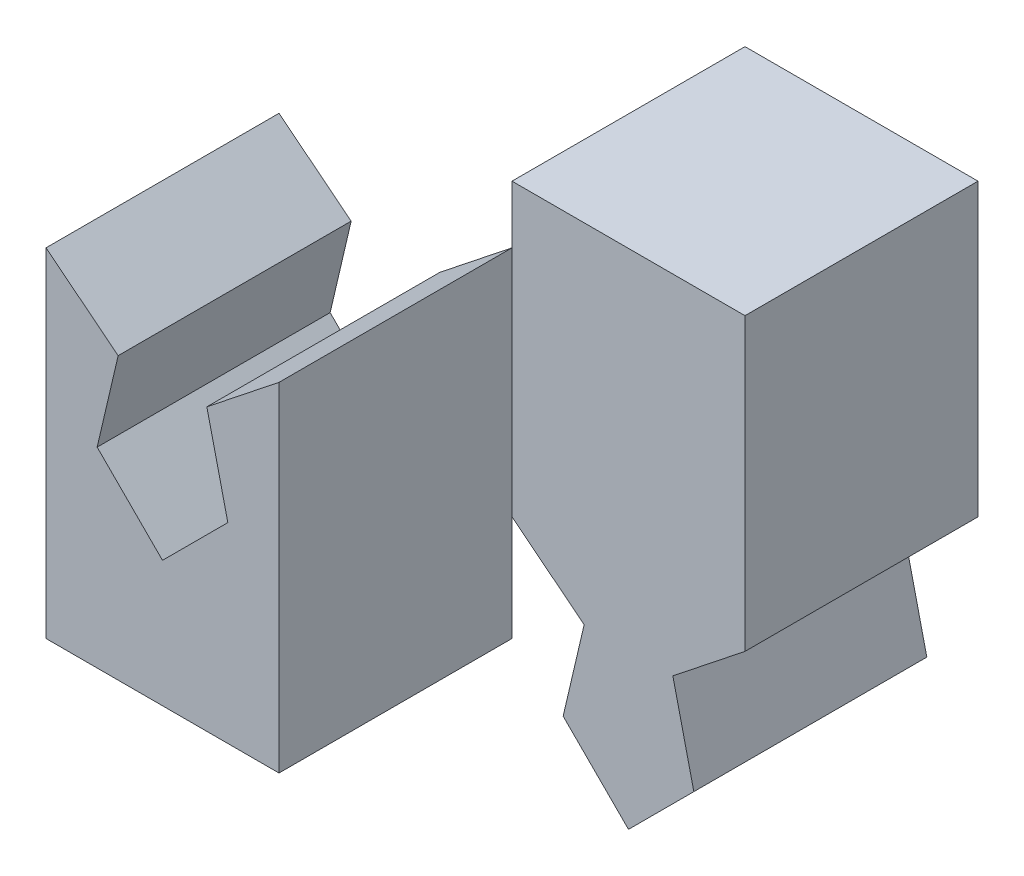
ISO-10303-21;
HEADER;
FILE_DESCRIPTION(('STEP AP214'),'2;1');
FILE_NAME('part.step','',(''),(''),'','','');
FILE_SCHEMA(('AUTOMOTIVE_DESIGN { 1 0 10303 214 1 1 1 1 }'));
ENDSEC;
DATA;
#1=APPLICATION_CONTEXT('core data for automotive mechanical design processes');
#2=APPLICATION_PROTOCOL_DEFINITION('international standard','automotive_design',2000,#1);
#3=PRODUCT_CONTEXT('',#1,'mechanical');
#4=PRODUCT('Part','Part','',(#3));
#5=PRODUCT_RELATED_PRODUCT_CATEGORY('part','',(#4));
#6=PRODUCT_DEFINITION_FORMATION('','',#4);
#7=PRODUCT_DEFINITION_CONTEXT('part definition',#1,'design');
#8=PRODUCT_DEFINITION('design','',#6,#7);
#9=PRODUCT_DEFINITION_SHAPE('','',#8);
#10=(LENGTH_UNIT() NAMED_UNIT(*) SI_UNIT(.MILLI.,.METRE.));
#11=(NAMED_UNIT(*) PLANE_ANGLE_UNIT() SI_UNIT($,.RADIAN.));
#12=(NAMED_UNIT(*) SI_UNIT($,.STERADIAN.) SOLID_ANGLE_UNIT());
#13=UNCERTAINTY_MEASURE_WITH_UNIT(LENGTH_MEASURE(1.E-05),#10,'distance_accuracy_value','');
#14=(GEOMETRIC_REPRESENTATION_CONTEXT(3) GLOBAL_UNCERTAINTY_ASSIGNED_CONTEXT((#13)) GLOBAL_UNIT_ASSIGNED_CONTEXT((#10,
#11,#12)) REPRESENTATION_CONTEXT('',''));
#15=CARTESIAN_POINT('',(0.,0.,0.));
#16=DIRECTION('',(0.,0.,1.));
#17=DIRECTION('',(1.,0.,0.));
#18=AXIS2_PLACEMENT_3D('',#15,#16,#17);
#19=CARTESIAN_POINT('',(12.5,13.5,-2.5));
#20=DIRECTION('',(-1.,0.,0.));
#21=DIRECTION('',(0.,0.,1.));
#22=AXIS2_PLACEMENT_3D('',#19,#20,#21);
#23=PLANE('',#22);
#24=DIRECTION('',(0.,-1.,0.));
#25=VECTOR('',#24,1.);
#26=CARTESIAN_POINT('',(12.5,13.5,2.5));
#27=LINE('',#26,#25);
#28=CARTESIAN_POINT('',(12.5,13.5,2.5));
#29=VERTEX_POINT('',#28);
#30=CARTESIAN_POINT('',(12.5,7.2608694026126,2.5));
#31=VERTEX_POINT('',#30);
#32=EDGE_CURVE('E182',#29,#31,#27,.T.);
#33=ORIENTED_EDGE('',*,*,#32,.T.);
#34=DIRECTION('',(0.,0.,1.));
#35=VECTOR('',#34,1.);
#36=CARTESIAN_POINT('',(12.5,7.2608694026126,-11.));
#37=LINE('',#36,#35);
#38=CARTESIAN_POINT('',(12.5,7.2608694026126,-2.5));
#39=VERTEX_POINT('',#38);
#40=EDGE_CURVE('E59',#39,#31,#37,.T.);
#41=ORIENTED_EDGE('',*,*,#40,.F.);
#42=DIRECTION('',(0.,-1.,0.));
#43=VECTOR('',#42,1.);
#44=CARTESIAN_POINT('',(12.5,13.5,-2.5));
#45=LINE('',#44,#43);
#46=CARTESIAN_POINT('',(12.5,13.5,-2.5));
#47=VERTEX_POINT('',#46);
#48=EDGE_CURVE('E12',#47,#39,#45,.T.);
#49=ORIENTED_EDGE('',*,*,#48,.F.);
#50=DIRECTION('',(0.,0.,-1.));
#51=VECTOR('',#50,1.);
#52=CARTESIAN_POINT('',(12.5,13.5,-2.5));
#53=LINE('',#52,#51);
#54=EDGE_CURVE('E175',#29,#47,#53,.T.);
#55=ORIENTED_EDGE('',*,*,#54,.F.);
#56=EDGE_LOOP('',(#33,#41,#49,#55));
#57=FACE_BOUND('',#56,.T.);
#58=ADVANCED_FACE('F45',(#57),#23,.F.);
#59=CARTESIAN_POINT('',(7.5,13.5,-2.5));
#60=DIRECTION('',(0.,0.,1.));
#61=DIRECTION('',(1.,0.,0.));
#62=AXIS2_PLACEMENT_3D('',#59,#60,#61);
#63=PLANE('',#62);
#64=DIRECTION('',(0.227884467377887,0.973688178796424,0.));
#65=VECTOR('',#64,1.);
#66=CARTESIAN_POINT('',(10.6252477350819,12.7685590407255,-2.5));
#67=LINE('',#66,#65);
#68=CARTESIAN_POINT('',(8.59767658269611,4.10530048053174,-2.5));
#69=VERTEX_POINT('',#68);
#70=CARTESIAN_POINT('',(9.04847214299338,6.03142696543824,-2.5));
#71=VERTEX_POINT('',#70);
#72=EDGE_CURVE('E169',#69,#71,#67,.T.);
#73=ORIENTED_EDGE('',*,*,#72,.T.);
#74=DIRECTION('',(-0.783166662523969,0.621811851536353,0.));
#75=VECTOR('',#74,1.);
#76=CARTESIAN_POINT('',(4.46165375378477,9.67322911526801,-2.5));
#77=LINE('',#76,#75);
#78=CARTESIAN_POINT('',(7.5,7.2608694026126,-2.5));
#79=VERTEX_POINT('',#78);
#80=EDGE_CURVE('E172',#71,#79,#77,.T.);
#81=ORIENTED_EDGE('',*,*,#80,.T.);
#82=DIRECTION('',(0.,-1.,0.));
#83=VECTOR('',#82,1.);
#84=CARTESIAN_POINT('',(7.5,13.5,-2.5));
#85=LINE('',#84,#83);
#86=CARTESIAN_POINT('',(7.5,13.5,-2.5));
#87=VERTEX_POINT('',#86);
#88=EDGE_CURVE('E52',#87,#79,#85,.T.);
#89=ORIENTED_EDGE('',*,*,#88,.F.);
#90=DIRECTION('',(-1.,0.,0.));
#91=VECTOR('',#90,1.);
#92=CARTESIAN_POINT('',(7.5,13.5,-2.5));
#93=LINE('',#92,#91);
#94=EDGE_CURVE('E177',#47,#87,#93,.T.);
#95=ORIENTED_EDGE('',*,*,#94,.F.);
#96=ORIENTED_EDGE('',*,*,#48,.T.);
#97=DIRECTION('',(-0.783166662523969,-0.621811851536354,0.));
#98=VECTOR('',#97,1.);
#99=CARTESIAN_POINT('',(12.4715961397706,7.23831755284014,-2.5));
#100=LINE('',#99,#98);
#101=CARTESIAN_POINT('',(10.9515278570066,6.03142696543824,-2.5));
#102=VERTEX_POINT('',#101);
#103=EDGE_CURVE('E152',#39,#102,#100,.T.);
#104=ORIENTED_EDGE('',*,*,#103,.T.);
#105=DIRECTION('',(0.227884467377887,-0.973688178796424,0.));
#106=VECTOR('',#105,1.);
#107=CARTESIAN_POINT('',(9.11509561255759,13.8780011008114,-2.5));
#108=LINE('',#107,#106);
#109=CARTESIAN_POINT('',(11.4023234173039,4.10530048053174,-2.5));
#110=VERTEX_POINT('',#109);
#111=EDGE_CURVE('E124',#102,#110,#108,.T.);
#112=ORIENTED_EDGE('',*,*,#111,.T.);
#113=DIRECTION('',(-0.707106781186548,-0.707106781186548,0.));
#114=VECTOR('',#113,1.);
#115=CARTESIAN_POINT('',(14.1485114683861,6.85148853161393,-2.5));
#116=LINE('',#115,#114);
#117=CARTESIAN_POINT('',(10.,2.70297706322785,-2.5));
#118=VERTEX_POINT('',#117);
#119=EDGE_CURVE('E163',#110,#118,#116,.T.);
#120=ORIENTED_EDGE('',*,*,#119,.T.);
#121=DIRECTION('',(-0.707106781186548,0.707106781186548,0.));
#122=VECTOR('',#121,1.);
#123=CARTESIAN_POINT('',(3.35148853161393,9.35148853161392,-2.5));
#124=LINE('',#123,#122);
#125=EDGE_CURVE('E166',#118,#69,#124,.T.);
#126=ORIENTED_EDGE('',*,*,#125,.T.);
#127=EDGE_LOOP('',(#73,#81,#89,#95,#96,#104,#112,#120,#126));
#128=FACE_BOUND('',#127,.T.);
#129=ADVANCED_FACE('F192',(#128),#63,.F.);
#130=CARTESIAN_POINT('',(7.5,13.5,-2.5));
#131=DIRECTION('',(1.,0.,0.));
#132=DIRECTION('',(0.,0.,-1.));
#133=AXIS2_PLACEMENT_3D('',#130,#131,#132);
#134=PLANE('',#133);
#135=ORIENTED_EDGE('',*,*,#88,.T.);
#136=DIRECTION('',(0.,0.,1.));
#137=VECTOR('',#136,1.);
#138=CARTESIAN_POINT('',(7.5,7.2608694026126,-11.));
#139=LINE('',#138,#137);
#140=CARTESIAN_POINT('',(7.5,7.2608694026126,2.5));
#141=VERTEX_POINT('',#140);
#142=EDGE_CURVE('E149',#79,#141,#139,.T.);
#143=ORIENTED_EDGE('',*,*,#142,.T.);
#144=DIRECTION('',(0.,-1.,0.));
#145=VECTOR('',#144,1.);
#146=CARTESIAN_POINT('',(7.5,13.5,2.5));
#147=LINE('',#146,#145);
#148=CARTESIAN_POINT('',(7.5,13.5,2.5));
#149=VERTEX_POINT('',#148);
#150=EDGE_CURVE('E184',#149,#141,#147,.T.);
#151=ORIENTED_EDGE('',*,*,#150,.F.);
#152=DIRECTION('',(0.,0.,1.));
#153=VECTOR('',#152,1.);
#154=CARTESIAN_POINT('',(7.5,13.5,-2.5));
#155=LINE('',#154,#153);
#156=EDGE_CURVE('E179',#87,#149,#155,.T.);
#157=ORIENTED_EDGE('',*,*,#156,.F.);
#158=EDGE_LOOP('',(#135,#143,#151,#157));
#159=FACE_BOUND('',#158,.T.);
#160=ADVANCED_FACE('F189',(#159),#134,.F.);
#161=CARTESIAN_POINT('',(7.5,13.5,2.5));
#162=DIRECTION('',(0.,0.,-1.));
#163=DIRECTION('',(-1.,0.,0.));
#164=AXIS2_PLACEMENT_3D('',#161,#162,#163);
#165=PLANE('',#164);
#166=ORIENTED_EDGE('',*,*,#150,.T.);
#167=DIRECTION('',(-0.783166662523969,0.621811851536353,0.));
#168=VECTOR('',#167,1.);
#169=CARTESIAN_POINT('',(7.5,7.2608694026126,2.5));
#170=LINE('',#169,#168);
#171=CARTESIAN_POINT('',(9.04847214299338,6.03142696543824,2.5));
#172=VERTEX_POINT('',#171);
#173=EDGE_CURVE('E147',#172,#141,#170,.T.);
#174=ORIENTED_EDGE('',*,*,#173,.F.);
#175=DIRECTION('',(0.227884467377887,0.973688178796424,0.));
#176=VECTOR('',#175,1.);
#177=CARTESIAN_POINT('',(9.04847214299338,6.03142696543824,2.5));
#178=LINE('',#177,#176);
#179=CARTESIAN_POINT('',(8.59767658269611,4.10530048053174,2.5));
#180=VERTEX_POINT('',#179);
#181=EDGE_CURVE('E144',#180,#172,#178,.T.);
#182=ORIENTED_EDGE('',*,*,#181,.F.);
#183=DIRECTION('',(-0.707106781186548,0.707106781186548,0.));
#184=VECTOR('',#183,1.);
#185=CARTESIAN_POINT('',(8.59767658269611,4.10530048053174,2.5));
#186=LINE('',#185,#184);
#187=CARTESIAN_POINT('',(10.,2.70297706322785,2.5));
#188=VERTEX_POINT('',#187);
#189=EDGE_CURVE('E139',#188,#180,#186,.T.);
#190=ORIENTED_EDGE('',*,*,#189,.F.);
#191=DIRECTION('',(-0.707106781186548,-0.707106781186548,0.));
#192=VECTOR('',#191,1.);
#193=CARTESIAN_POINT('',(11.4023234173039,4.10530048053174,2.5));
#194=LINE('',#193,#192);
#195=CARTESIAN_POINT('',(11.4023234173039,4.10530048053174,2.5));
#196=VERTEX_POINT('',#195);
#197=EDGE_CURVE('E137',#196,#188,#194,.T.);
#198=ORIENTED_EDGE('',*,*,#197,.F.);
#199=DIRECTION('',(0.227884467377887,-0.973688178796424,0.));
#200=VECTOR('',#199,1.);
#201=CARTESIAN_POINT('',(10.9515278570066,6.03142696543824,2.5));
#202=LINE('',#201,#200);
#203=CARTESIAN_POINT('',(10.9515278570066,6.03142696543824,2.5));
#204=VERTEX_POINT('',#203);
#205=EDGE_CURVE('E121',#204,#196,#202,.T.);
#206=ORIENTED_EDGE('',*,*,#205,.F.);
#207=DIRECTION('',(-0.783166662523969,-0.621811851536354,0.));
#208=VECTOR('',#207,1.);
#209=CARTESIAN_POINT('',(12.5,7.2608694026126,2.5));
#210=LINE('',#209,#208);
#211=EDGE_CURVE('E128',#31,#204,#210,.T.);
#212=ORIENTED_EDGE('',*,*,#211,.F.);
#213=ORIENTED_EDGE('',*,*,#32,.F.);
#214=DIRECTION('',(1.,0.,0.));
#215=VECTOR('',#214,1.);
#216=CARTESIAN_POINT('',(7.5,13.5,2.5));
#217=LINE('',#216,#215);
#218=EDGE_CURVE('E67',#149,#29,#217,.T.);
#219=ORIENTED_EDGE('',*,*,#218,.F.);
#220=EDGE_LOOP('',(#166,#174,#182,#190,#198,#206,#212,#213,#219));
#221=FACE_BOUND('',#220,.T.);
#222=ADVANCED_FACE('F134',(#221),#165,.F.);
#223=CARTESIAN_POINT('',(0.,13.5,0.));
#224=DIRECTION('',(0.,1.,0.));
#225=DIRECTION('',(0.,0.,1.));
#226=AXIS2_PLACEMENT_3D('',#223,#224,#225);
#227=PLANE('',#226);
#228=ORIENTED_EDGE('',*,*,#54,.T.);
#229=ORIENTED_EDGE('',*,*,#94,.T.);
#230=ORIENTED_EDGE('',*,*,#156,.T.);
#231=ORIENTED_EDGE('',*,*,#218,.T.);
#232=EDGE_LOOP('',(#228,#229,#230,#231));
#233=FACE_BOUND('',#232,.T.);
#234=ADVANCED_FACE('F204',(#233),#227,.T.);
#235=CARTESIAN_POINT('',(7.5,7.2608694026126,-11.));
#236=DIRECTION('',(0.621811851536353,0.783166662523969,0.));
#237=DIRECTION('',(-0.783166662523969,0.621811851536353,0.));
#238=AXIS2_PLACEMENT_3D('',#235,#236,#237);
#239=PLANE('',#238);
#240=DIRECTION('',(0.,0.,1.));
#241=VECTOR('',#240,1.);
#242=CARTESIAN_POINT('',(9.04847214299338,6.03142696543824,-11.));
#243=LINE('',#242,#241);
#244=EDGE_CURVE('E153',#71,#172,#243,.T.);
#245=ORIENTED_EDGE('',*,*,#244,.T.);
#246=ORIENTED_EDGE('',*,*,#173,.T.);
#247=ORIENTED_EDGE('',*,*,#142,.F.);
#248=ORIENTED_EDGE('',*,*,#80,.F.);
#249=EDGE_LOOP('',(#245,#246,#247,#248));
#250=FACE_BOUND('',#249,.T.);
#251=ADVANCED_FACE('F195',(#250),#239,.F.);
#252=CARTESIAN_POINT('',(9.04847214299338,6.03142696543824,-11.));
#253=DIRECTION('',(0.973688178796424,-0.227884467377887,0.));
#254=DIRECTION('',(0.227884467377887,0.973688178796424,0.));
#255=AXIS2_PLACEMENT_3D('',#252,#253,#254);
#256=PLANE('',#255);
#257=DIRECTION('',(0.,0.,1.));
#258=VECTOR('',#257,1.);
#259=CARTESIAN_POINT('',(8.59767658269611,4.10530048053174,-11.));
#260=LINE('',#259,#258);
#261=EDGE_CURVE('E155',#69,#180,#260,.T.);
#262=ORIENTED_EDGE('',*,*,#261,.T.);
#263=ORIENTED_EDGE('',*,*,#181,.T.);
#264=ORIENTED_EDGE('',*,*,#244,.F.);
#265=ORIENTED_EDGE('',*,*,#72,.F.);
#266=EDGE_LOOP('',(#262,#263,#264,#265));
#267=FACE_BOUND('',#266,.T.);
#268=ADVANCED_FACE('F197',(#267),#256,.F.);
#269=CARTESIAN_POINT('',(8.59767658269611,4.10530048053174,-11.));
#270=DIRECTION('',(0.707106781186547,0.707106781186547,0.));
#271=DIRECTION('',(-0.707106781186548,0.707106781186548,0.));
#272=AXIS2_PLACEMENT_3D('',#269,#270,#271);
#273=PLANE('',#272);
#274=DIRECTION('',(0.,0.,1.));
#275=VECTOR('',#274,1.);
#276=CARTESIAN_POINT('',(10.,2.70297706322785,-11.));
#277=LINE('',#276,#275);
#278=EDGE_CURVE('E157',#118,#188,#277,.T.);
#279=ORIENTED_EDGE('',*,*,#278,.T.);
#280=ORIENTED_EDGE('',*,*,#189,.T.);
#281=ORIENTED_EDGE('',*,*,#261,.F.);
#282=ORIENTED_EDGE('',*,*,#125,.F.);
#283=EDGE_LOOP('',(#279,#280,#281,#282));
#284=FACE_BOUND('',#283,.T.);
#285=ADVANCED_FACE('F244',(#284),#273,.F.);
#286=CARTESIAN_POINT('',(11.4023234173039,4.10530048053174,-11.));
#287=DIRECTION('',(-0.707106781186547,0.707106781186547,0.));
#288=DIRECTION('',(-0.707106781186548,-0.707106781186548,0.));
#289=AXIS2_PLACEMENT_3D('',#286,#287,#288);
#290=PLANE('',#289);
#291=DIRECTION('',(0.,0.,1.));
#292=VECTOR('',#291,1.);
#293=CARTESIAN_POINT('',(11.4023234173039,4.10530048053174,-11.));
#294=LINE('',#293,#292);
#295=EDGE_CURVE('E126',#110,#196,#294,.T.);
#296=ORIENTED_EDGE('',*,*,#295,.T.);
#297=ORIENTED_EDGE('',*,*,#197,.T.);
#298=ORIENTED_EDGE('',*,*,#278,.F.);
#299=ORIENTED_EDGE('',*,*,#119,.F.);
#300=EDGE_LOOP('',(#296,#297,#298,#299));
#301=FACE_BOUND('',#300,.T.);
#302=ADVANCED_FACE('F253',(#301),#290,.F.);
#303=CARTESIAN_POINT('',(10.9515278570066,6.03142696543824,-11.));
#304=DIRECTION('',(-0.973688178796424,-0.227884467377887,0.));
#305=DIRECTION('',(0.227884467377887,-0.973688178796424,0.));
#306=AXIS2_PLACEMENT_3D('',#303,#304,#305);
#307=PLANE('',#306);
#308=DIRECTION('',(0.,0.,1.));
#309=VECTOR('',#308,1.);
#310=CARTESIAN_POINT('',(10.9515278570066,6.03142696543824,-11.));
#311=LINE('',#310,#309);
#312=EDGE_CURVE('E117',#102,#204,#311,.T.);
#313=ORIENTED_EDGE('',*,*,#312,.T.);
#314=ORIENTED_EDGE('',*,*,#205,.T.);
#315=ORIENTED_EDGE('',*,*,#295,.F.);
#316=ORIENTED_EDGE('',*,*,#111,.F.);
#317=EDGE_LOOP('',(#313,#314,#315,#316));
#318=FACE_BOUND('',#317,.T.);
#319=ADVANCED_FACE('F118',(#318),#307,.F.);
#320=CARTESIAN_POINT('',(12.5,7.2608694026126,-11.));
#321=DIRECTION('',(-0.621811851536354,0.783166662523969,0.));
#322=DIRECTION('',(-0.783166662523969,-0.621811851536354,0.));
#323=AXIS2_PLACEMENT_3D('',#320,#321,#322);
#324=PLANE('',#323);
#325=ORIENTED_EDGE('',*,*,#40,.T.);
#326=ORIENTED_EDGE('',*,*,#211,.T.);
#327=ORIENTED_EDGE('',*,*,#312,.F.);
#328=ORIENTED_EDGE('',*,*,#103,.F.);
#329=EDGE_LOOP('',(#325,#326,#327,#328));
#330=FACE_BOUND('',#329,.T.);
#331=ADVANCED_FACE('F129',(#330),#324,.F.);
#332=CLOSED_SHELL('',(#58,#129,#160,#222,#234,#251,#268,#285,#302,#319,#331));
#333=MANIFOLD_SOLID_BREP('B2',#332);
#334=CARTESIAN_POINT('',(-2.5,13.5,2.5));
#335=DIRECTION('',(0.,0.,-1.));
#336=DIRECTION('',(-1.,0.,0.));
#337=AXIS2_PLACEMENT_3D('',#334,#335,#336);
#338=PLANE('',#337);
#339=DIRECTION('',(0.,-1.,0.));
#340=VECTOR('',#339,1.);
#341=CARTESIAN_POINT('',(2.5,13.5,2.5));
#342=LINE('',#341,#340);
#343=CARTESIAN_POINT('',(2.5,7.2608694026126,2.5));
#344=VERTEX_POINT('',#343);
#345=CARTESIAN_POINT('',(2.5,0.,2.5));
#346=VERTEX_POINT('',#345);
#347=EDGE_CURVE('E396',#344,#346,#342,.T.);
#348=ORIENTED_EDGE('',*,*,#347,.F.);
#349=DIRECTION('',(0.783166662523969,0.621811851536353,0.));
#350=VECTOR('',#349,1.);
#351=CARTESIAN_POINT('',(2.5,7.2608694026126,2.5));
#352=LINE('',#351,#350);
#353=CARTESIAN_POINT('',(0.951527857006619,6.03142696543824,2.5));
#354=VERTEX_POINT('',#353);
#355=EDGE_CURVE('E376',#354,#344,#352,.T.);
#356=ORIENTED_EDGE('',*,*,#355,.F.);
#357=DIRECTION('',(-0.227884467377887,0.973688178796424,0.));
#358=VECTOR('',#357,1.);
#359=CARTESIAN_POINT('',(0.951527857006619,6.03142696543824,2.5));
#360=LINE('',#359,#358);
#361=CARTESIAN_POINT('',(1.40232341730389,4.10530048053174,2.5));
#362=VERTEX_POINT('',#361);
#363=EDGE_CURVE('E453',#362,#354,#360,.T.);
#364=ORIENTED_EDGE('',*,*,#363,.F.);
#365=DIRECTION('',(0.707106781186548,0.707106781186548,0.));
#366=VECTOR('',#365,1.);
#367=CARTESIAN_POINT('',(1.40232341730389,4.10530048053174,2.5));
#368=LINE('',#367,#366);
#369=CARTESIAN_POINT('',(0.,2.70297706322785,2.5));
#370=VERTEX_POINT('',#369);
#371=EDGE_CURVE('E419',#370,#362,#368,.T.);
#372=ORIENTED_EDGE('',*,*,#371,.F.);
#373=DIRECTION('',(0.707106781186548,-0.707106781186548,0.));
#374=VECTOR('',#373,1.);
#375=CARTESIAN_POINT('',(-1.40232341730389,4.10530048053174,2.5));
#376=LINE('',#375,#374);
#377=CARTESIAN_POINT('',(-1.40232341730389,4.10530048053174,2.5));
#378=VERTEX_POINT('',#377);
#379=EDGE_CURVE('E548',#378,#370,#376,.T.);
#380=ORIENTED_EDGE('',*,*,#379,.F.);
#381=DIRECTION('',(-0.227884467377887,-0.973688178796424,0.));
#382=VECTOR('',#381,1.);
#383=CARTESIAN_POINT('',(-0.951527857006619,6.03142696543824,2.5));
#384=LINE('',#383,#382);
#385=CARTESIAN_POINT('',(-0.951527857006619,6.03142696543824,2.5));
#386=VERTEX_POINT('',#385);
#387=EDGE_CURVE('E381',#386,#378,#384,.T.);
#388=ORIENTED_EDGE('',*,*,#387,.F.);
#389=DIRECTION('',(0.783166662523969,-0.621811851536353,0.));
#390=VECTOR('',#389,1.);
#391=CARTESIAN_POINT('',(-2.5,7.2608694026126,2.5));
#392=LINE('',#391,#390);
#393=CARTESIAN_POINT('',(-2.5,7.2608694026126,2.5));
#394=VERTEX_POINT('',#393);
#395=EDGE_CURVE('E371',#394,#386,#392,.T.);
#396=ORIENTED_EDGE('',*,*,#395,.F.);
#397=DIRECTION('',(0.,-1.,0.));
#398=VECTOR('',#397,1.);
#399=CARTESIAN_POINT('',(-2.5,13.5,2.5));
#400=LINE('',#399,#398);
#401=CARTESIAN_POINT('',(-2.5,0.,2.5));
#402=VERTEX_POINT('',#401);
#403=EDGE_CURVE('E321',#394,#402,#400,.T.);
#404=ORIENTED_EDGE('',*,*,#403,.T.);
#405=DIRECTION('',(1.,0.,0.));
#406=VECTOR('',#405,1.);
#407=CARTESIAN_POINT('',(-2.5,0.,2.5));
#408=LINE('',#407,#406);
#409=EDGE_CURVE('E438',#402,#346,#408,.T.);
#410=ORIENTED_EDGE('',*,*,#409,.T.);
#411=EDGE_LOOP('',(#348,#356,#364,#372,#380,#388,#396,#404,#410));
#412=FACE_BOUND('',#411,.T.);
#413=ADVANCED_FACE('F299',(#412),#338,.F.);
#414=CARTESIAN_POINT('',(2.5,13.5,-2.5));
#415=DIRECTION('',(1.,0.,0.));
#416=DIRECTION('',(0.,0.,-1.));
#417=AXIS2_PLACEMENT_3D('',#414,#415,#416);
#418=PLANE('',#417);
#419=DIRECTION('',(0.,0.,1.));
#420=VECTOR('',#419,1.);
#421=CARTESIAN_POINT('',(2.5,7.2608694026126,-11.));
#422=LINE('',#421,#420);
#423=CARTESIAN_POINT('',(2.5,7.2608694026126,-2.5));
#424=VERTEX_POINT('',#423);
#425=EDGE_CURVE('E439',#424,#344,#422,.T.);
#426=ORIENTED_EDGE('',*,*,#425,.T.);
#427=ORIENTED_EDGE('',*,*,#347,.T.);
#428=DIRECTION('',(0.,0.,1.));
#429=VECTOR('',#428,1.);
#430=CARTESIAN_POINT('',(2.5,0.,-2.5));
#431=LINE('',#430,#429);
#432=CARTESIAN_POINT('',(2.5,0.,-2.5));
#433=VERTEX_POINT('',#432);
#434=EDGE_CURVE('E441',#433,#346,#431,.T.);
#435=ORIENTED_EDGE('',*,*,#434,.F.);
#436=DIRECTION('',(0.,-1.,0.));
#437=VECTOR('',#436,1.);
#438=CARTESIAN_POINT('',(2.5,13.5,-2.5));
#439=LINE('',#438,#437);
#440=EDGE_CURVE('E389',#424,#433,#439,.T.);
#441=ORIENTED_EDGE('',*,*,#440,.F.);
#442=EDGE_LOOP('',(#426,#427,#435,#441));
#443=FACE_BOUND('',#442,.T.);
#444=ADVANCED_FACE('F451',(#443),#418,.T.);
#445=CARTESIAN_POINT('',(-2.5,13.5,-2.5));
#446=DIRECTION('',(0.,0.,-1.));
#447=DIRECTION('',(-1.,0.,0.));
#448=AXIS2_PLACEMENT_3D('',#445,#446,#447);
#449=PLANE('',#448);
#450=DIRECTION('',(-0.783166662523969,-0.621811851536353,0.));
#451=VECTOR('',#450,1.);
#452=CARTESIAN_POINT('',(2.47159613977057,7.23831755284013,-2.5));
#453=LINE('',#452,#451);
#454=CARTESIAN_POINT('',(0.951527857006619,6.03142696543824,-2.5));
#455=VERTEX_POINT('',#454);
#456=EDGE_CURVE('E43',#424,#455,#453,.T.);
#457=ORIENTED_EDGE('',*,*,#456,.F.);
#458=ORIENTED_EDGE('',*,*,#440,.T.);
#459=DIRECTION('',(1.,0.,0.));
#460=VECTOR('',#459,1.);
#461=CARTESIAN_POINT('',(-2.5,0.,-2.5));
#462=LINE('',#461,#460);
#463=CARTESIAN_POINT('',(-2.5,0.,-2.5));
#464=VERTEX_POINT('',#463);
#465=EDGE_CURVE('E391',#464,#433,#462,.T.);
#466=ORIENTED_EDGE('',*,*,#465,.F.);
#467=DIRECTION('',(0.,-1.,0.));
#468=VECTOR('',#467,1.);
#469=CARTESIAN_POINT('',(-2.5,13.5,-2.5));
#470=LINE('',#469,#468);
#471=CARTESIAN_POINT('',(-2.5,7.2608694026126,-2.5));
#472=VERTEX_POINT('',#471);
#473=EDGE_CURVE('E387',#472,#464,#470,.T.);
#474=ORIENTED_EDGE('',*,*,#473,.F.);
#475=DIRECTION('',(-0.783166662523969,0.621811851536353,0.));
#476=VECTOR('',#475,1.);
#477=CARTESIAN_POINT('',(-5.53834624621523,9.67322911526801,-2.5));
#478=LINE('',#477,#476);
#479=CARTESIAN_POINT('',(-0.951527857006619,6.03142696543824,-2.5));
#480=VERTEX_POINT('',#479);
#481=EDGE_CURVE('E313',#480,#472,#478,.T.);
#482=ORIENTED_EDGE('',*,*,#481,.F.);
#483=DIRECTION('',(0.227884467377887,0.973688178796424,0.));
#484=VECTOR('',#483,1.);
#485=CARTESIAN_POINT('',(0.625247735081895,12.7685590407255,-2.5));
#486=LINE('',#485,#484);
#487=CARTESIAN_POINT('',(-1.40232341730389,4.10530048053174,-2.5));
#488=VERTEX_POINT('',#487);
#489=EDGE_CURVE('E398',#488,#480,#486,.T.);
#490=ORIENTED_EDGE('',*,*,#489,.F.);
#491=DIRECTION('',(-0.707106781186548,0.707106781186548,0.));
#492=VECTOR('',#491,1.);
#493=CARTESIAN_POINT('',(-6.64851146838608,9.35148853161392,-2.5));
#494=LINE('',#493,#492);
#495=CARTESIAN_POINT('',(0.,2.70297706322785,-2.5));
#496=VERTEX_POINT('',#495);
#497=EDGE_CURVE('E400',#496,#488,#494,.T.);
#498=ORIENTED_EDGE('',*,*,#497,.F.);
#499=DIRECTION('',(-0.707106781186548,-0.707106781186548,0.));
#500=VECTOR('',#499,1.);
#501=CARTESIAN_POINT('',(4.14851146838607,6.85148853161393,-2.5));
#502=LINE('',#501,#500);
#503=CARTESIAN_POINT('',(1.40232341730389,4.10530048053174,-2.5));
#504=VERTEX_POINT('',#503);
#505=EDGE_CURVE('E402',#504,#496,#502,.T.);
#506=ORIENTED_EDGE('',*,*,#505,.F.);
#507=DIRECTION('',(0.227884467377887,-0.973688178796424,0.));
#508=VECTOR('',#507,1.);
#509=CARTESIAN_POINT('',(-0.884904387442411,13.8780011008114,-2.5));
#510=LINE('',#509,#508);
#511=EDGE_CURVE('E306',#455,#504,#510,.T.);
#512=ORIENTED_EDGE('',*,*,#511,.F.);
#513=EDGE_LOOP('',(#457,#458,#466,#474,#482,#490,#498,#506,#512));
#514=FACE_BOUND('',#513,.T.);
#515=ADVANCED_FACE('F424',(#514),#449,.T.);
#516=CARTESIAN_POINT('',(-2.5,13.5,-2.5));
#517=DIRECTION('',(1.,0.,0.));
#518=DIRECTION('',(0.,0.,-1.));
#519=AXIS2_PLACEMENT_3D('',#516,#517,#518);
#520=PLANE('',#519);
#521=ORIENTED_EDGE('',*,*,#403,.F.);
#522=DIRECTION('',(0.,0.,1.));
#523=VECTOR('',#522,1.);
#524=CARTESIAN_POINT('',(-2.5,7.2608694026126,-11.));
#525=LINE('',#524,#523);
#526=EDGE_CURVE('E369',#472,#394,#525,.T.);
#527=ORIENTED_EDGE('',*,*,#526,.F.);
#528=ORIENTED_EDGE('',*,*,#473,.T.);
#529=DIRECTION('',(0.,0.,1.));
#530=VECTOR('',#529,1.);
#531=CARTESIAN_POINT('',(-2.5,0.,-2.5));
#532=LINE('',#531,#530);
#533=EDGE_CURVE('E385',#464,#402,#532,.T.);
#534=ORIENTED_EDGE('',*,*,#533,.T.);
#535=EDGE_LOOP('',(#521,#527,#528,#534));
#536=FACE_BOUND('',#535,.T.);
#537=ADVANCED_FACE('F383',(#536),#520,.F.);
#538=CARTESIAN_POINT('',(0.,0.,0.));
#539=DIRECTION('',(0.,-1.,0.));
#540=DIRECTION('',(0.,0.,-1.));
#541=AXIS2_PLACEMENT_3D('',#538,#539,#540);
#542=PLANE('',#541);
#543=ORIENTED_EDGE('',*,*,#409,.F.);
#544=ORIENTED_EDGE('',*,*,#533,.F.);
#545=ORIENTED_EDGE('',*,*,#465,.T.);
#546=ORIENTED_EDGE('',*,*,#434,.T.);
#547=EDGE_LOOP('',(#543,#544,#545,#546));
#548=FACE_BOUND('',#547,.T.);
#549=ADVANCED_FACE('F446',(#548),#542,.T.);
#550=CARTESIAN_POINT('',(2.5,7.2608694026126,-11.));
#551=DIRECTION('',(0.621811851536353,-0.783166662523969,0.));
#552=DIRECTION('',(0.783166662523969,0.621811851536353,0.));
#553=AXIS2_PLACEMENT_3D('',#550,#551,#552);
#554=PLANE('',#553);
#555=ORIENTED_EDGE('',*,*,#456,.T.);
#556=DIRECTION('',(0.,0.,1.));
#557=VECTOR('',#556,1.);
#558=CARTESIAN_POINT('',(0.951527857006619,6.03142696543824,-11.));
#559=LINE('',#558,#557);
#560=EDGE_CURVE('E411',#455,#354,#559,.T.);
#561=ORIENTED_EDGE('',*,*,#560,.T.);
#562=ORIENTED_EDGE('',*,*,#355,.T.);
#563=ORIENTED_EDGE('',*,*,#425,.F.);
#564=EDGE_LOOP('',(#555,#561,#562,#563));
#565=FACE_BOUND('',#564,.T.);
#566=ADVANCED_FACE('F460',(#565),#554,.F.);
#567=CARTESIAN_POINT('',(0.951527857006619,6.03142696543824,-11.));
#568=DIRECTION('',(0.973688178796424,0.227884467377887,0.));
#569=DIRECTION('',(-0.227884467377887,0.973688178796424,0.));
#570=AXIS2_PLACEMENT_3D('',#567,#568,#569);
#571=PLANE('',#570);
#572=ORIENTED_EDGE('',*,*,#511,.T.);
#573=DIRECTION('',(0.,0.,1.));
#574=VECTOR('',#573,1.);
#575=CARTESIAN_POINT('',(1.40232341730389,4.10530048053174,-11.));
#576=LINE('',#575,#574);
#577=EDGE_CURVE('E409',#504,#362,#576,.T.);
#578=ORIENTED_EDGE('',*,*,#577,.T.);
#579=ORIENTED_EDGE('',*,*,#363,.T.);
#580=ORIENTED_EDGE('',*,*,#560,.F.);
#581=EDGE_LOOP('',(#572,#578,#579,#580));
#582=FACE_BOUND('',#581,.T.);
#583=ADVANCED_FACE('F407',(#582),#571,.F.);
#584=CARTESIAN_POINT('',(1.40232341730389,4.10530048053174,-11.));
#585=DIRECTION('',(0.707106781186547,-0.707106781186547,0.));
#586=DIRECTION('',(0.707106781186548,0.707106781186548,0.));
#587=AXIS2_PLACEMENT_3D('',#584,#585,#586);
#588=PLANE('',#587);
#589=ORIENTED_EDGE('',*,*,#505,.T.);
#590=DIRECTION('',(0.,0.,1.));
#591=VECTOR('',#590,1.);
#592=CARTESIAN_POINT('',(0.,2.70297706322785,-11.));
#593=LINE('',#592,#591);
#594=EDGE_CURVE('E421',#496,#370,#593,.T.);
#595=ORIENTED_EDGE('',*,*,#594,.T.);
#596=ORIENTED_EDGE('',*,*,#371,.T.);
#597=ORIENTED_EDGE('',*,*,#577,.F.);
#598=EDGE_LOOP('',(#589,#595,#596,#597));
#599=FACE_BOUND('',#598,.T.);
#600=ADVANCED_FACE('F416',(#599),#588,.F.);
#601=CARTESIAN_POINT('',(-1.40232341730389,4.10530048053174,-11.));
#602=DIRECTION('',(-0.707106781186547,-0.707106781186547,0.));
#603=DIRECTION('',(0.707106781186548,-0.707106781186548,0.));
#604=AXIS2_PLACEMENT_3D('',#601,#602,#603);
#605=PLANE('',#604);
#606=ORIENTED_EDGE('',*,*,#497,.T.);
#607=DIRECTION('',(0.,0.,1.));
#608=VECTOR('',#607,1.);
#609=CARTESIAN_POINT('',(-1.40232341730389,4.10530048053174,-11.));
#610=LINE('',#609,#608);
#611=EDGE_CURVE('E430',#488,#378,#610,.T.);
#612=ORIENTED_EDGE('',*,*,#611,.T.);
#613=ORIENTED_EDGE('',*,*,#379,.T.);
#614=ORIENTED_EDGE('',*,*,#594,.F.);
#615=EDGE_LOOP('',(#606,#612,#613,#614));
#616=FACE_BOUND('',#615,.T.);
#617=ADVANCED_FACE('F428',(#616),#605,.F.);
#618=CARTESIAN_POINT('',(-0.951527857006619,6.03142696543824,-11.));
#619=DIRECTION('',(-0.973688178796424,0.227884467377887,0.));
#620=DIRECTION('',(-0.227884467377887,-0.973688178796424,0.));
#621=AXIS2_PLACEMENT_3D('',#618,#619,#620);
#622=PLANE('',#621);
#623=ORIENTED_EDGE('',*,*,#489,.T.);
#624=DIRECTION('',(0.,0.,1.));
#625=VECTOR('',#624,1.);
#626=CARTESIAN_POINT('',(-0.951527857006619,6.03142696543824,-11.));
#627=LINE('',#626,#625);
#628=EDGE_CURVE('E375',#480,#386,#627,.T.);
#629=ORIENTED_EDGE('',*,*,#628,.T.);
#630=ORIENTED_EDGE('',*,*,#387,.T.);
#631=ORIENTED_EDGE('',*,*,#611,.F.);
#632=EDGE_LOOP('',(#623,#629,#630,#631));
#633=FACE_BOUND('',#632,.T.);
#634=ADVANCED_FACE('F432',(#633),#622,.F.);
#635=CARTESIAN_POINT('',(-2.5,7.2608694026126,-11.));
#636=DIRECTION('',(-0.621811851536353,-0.783166662523969,0.));
#637=DIRECTION('',(0.783166662523969,-0.621811851536353,0.));
#638=AXIS2_PLACEMENT_3D('',#635,#636,#637);
#639=PLANE('',#638);
#640=ORIENTED_EDGE('',*,*,#481,.T.);
#641=ORIENTED_EDGE('',*,*,#526,.T.);
#642=ORIENTED_EDGE('',*,*,#395,.T.);
#643=ORIENTED_EDGE('',*,*,#628,.F.);
#644=EDGE_LOOP('',(#640,#641,#642,#643));
#645=FACE_BOUND('',#644,.T.);
#646=ADVANCED_FACE('F370',(#645),#639,.F.);
#647=CLOSED_SHELL('',(#413,#444,#515,#537,#549,#566,#583,#600,#617,#634,#646));
#648=MANIFOLD_SOLID_BREP('B6',#647);
#649=ADVANCED_BREP_SHAPE_REPRESENTATION('',(#18,#333,#648),#14);
#650=SHAPE_DEFINITION_REPRESENTATION(#9,#649);
ENDSEC;
END-ISO-10303-21;
